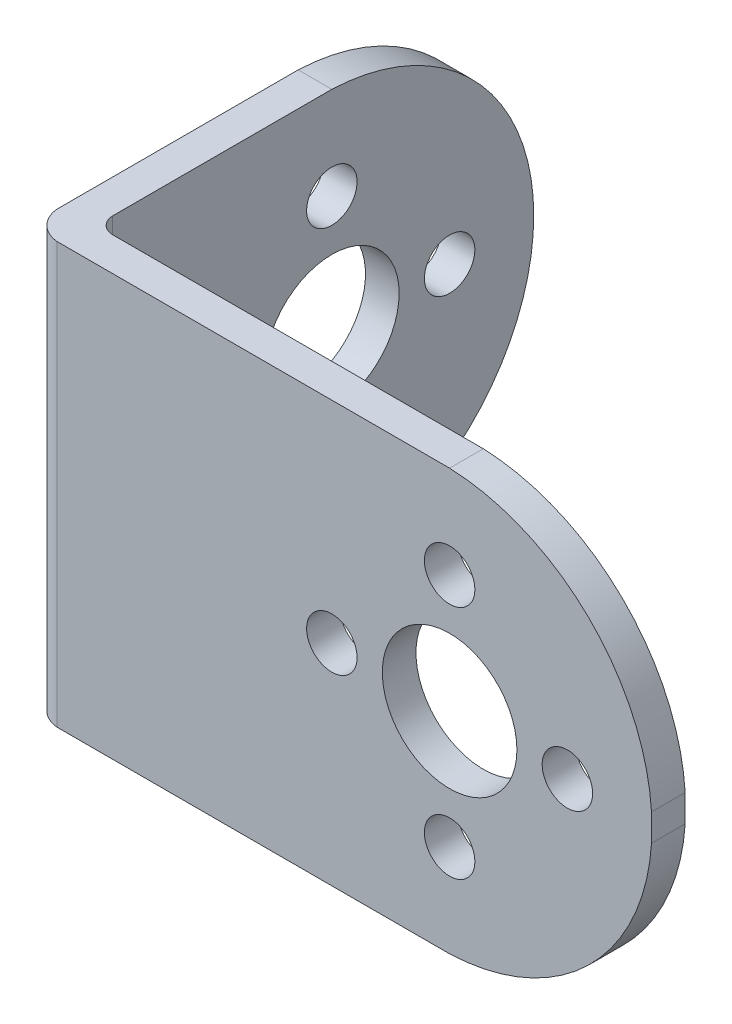
ISO-10303-21;
HEADER;
FILE_DESCRIPTION(('STEP AP214'),'2;1');
FILE_NAME('part.step','',(''),(''),'','','');
FILE_SCHEMA(('AUTOMOTIVE_DESIGN { 1 0 10303 214 1 1 1 1 }'));
ENDSEC;
DATA;
#1=APPLICATION_CONTEXT('core data for automotive mechanical design processes');
#2=APPLICATION_PROTOCOL_DEFINITION('international standard','automotive_design',2000,#1);
#3=PRODUCT_CONTEXT('',#1,'mechanical');
#4=PRODUCT('Part','Part','',(#3));
#5=PRODUCT_RELATED_PRODUCT_CATEGORY('part','',(#4));
#6=PRODUCT_DEFINITION_FORMATION('','',#4);
#7=PRODUCT_DEFINITION_CONTEXT('part definition',#1,'design');
#8=PRODUCT_DEFINITION('design','',#6,#7);
#9=PRODUCT_DEFINITION_SHAPE('','',#8);
#10=(LENGTH_UNIT() NAMED_UNIT(*) SI_UNIT(.MILLI.,.METRE.));
#11=(NAMED_UNIT(*) PLANE_ANGLE_UNIT() SI_UNIT($,.RADIAN.));
#12=(NAMED_UNIT(*) SI_UNIT($,.STERADIAN.) SOLID_ANGLE_UNIT());
#13=UNCERTAINTY_MEASURE_WITH_UNIT(LENGTH_MEASURE(1.E-05),#10,'distance_accuracy_value','');
#14=(GEOMETRIC_REPRESENTATION_CONTEXT(3) GLOBAL_UNCERTAINTY_ASSIGNED_CONTEXT((#13)) GLOBAL_UNIT_ASSIGNED_CONTEXT((#10,
#11,#12)) REPRESENTATION_CONTEXT('',''));
#15=CARTESIAN_POINT('',(0.,0.,0.));
#16=DIRECTION('',(0.,0.,1.));
#17=DIRECTION('',(1.,0.,0.));
#18=AXIS2_PLACEMENT_3D('',#15,#16,#17);
#19=CARTESIAN_POINT('',(0.,25.,0.));
#20=DIRECTION('',(0.,0.,-1.));
#21=DIRECTION('',(-1.,0.,0.));
#22=AXIS2_PLACEMENT_3D('',#19,#20,#21);
#23=PLANE('',#22);
#24=CARTESIAN_POINT('',(25.,19.5,0.));
#25=DIRECTION('',(0.,0.,1.));
#26=DIRECTION('',(1.,0.,0.));
#27=AXIS2_PLACEMENT_3D('',#24,#25,#26);
#28=CIRCLE('',#27,1.5);
#29=CARTESIAN_POINT('',(26.5,19.5,0.));
#30=VERTEX_POINT('',#29);
#31=EDGE_CURVE('E306',#30,#30,#28,.T.);
#32=ORIENTED_EDGE('',*,*,#31,.F.);
#33=EDGE_LOOP('',(#32));
#34=FACE_BOUND('',#33,.T.);
#35=CARTESIAN_POINT('',(32.0000000000001,12.5000000000001,0.));
#36=DIRECTION('',(0.,0.,1.));
#37=DIRECTION('',(1.,0.,0.));
#38=AXIS2_PLACEMENT_3D('',#35,#36,#37);
#39=CIRCLE('',#38,1.5);
#40=CARTESIAN_POINT('',(33.5000000000001,12.5000000000001,0.));
#41=VERTEX_POINT('',#40);
#42=EDGE_CURVE('E303',#41,#41,#39,.T.);
#43=ORIENTED_EDGE('',*,*,#42,.F.);
#44=EDGE_LOOP('',(#43));
#45=FACE_BOUND('',#44,.T.);
#46=CARTESIAN_POINT('',(25.0000000000002,5.5,0.));
#47=DIRECTION('',(0.,0.,1.));
#48=DIRECTION('',(1.,0.,0.));
#49=AXIS2_PLACEMENT_3D('',#46,#47,#48);
#50=CIRCLE('',#49,1.5);
#51=CARTESIAN_POINT('',(26.5000000000002,5.5,0.));
#52=VERTEX_POINT('',#51);
#53=EDGE_CURVE('E300',#52,#52,#50,.T.);
#54=ORIENTED_EDGE('',*,*,#53,.F.);
#55=EDGE_LOOP('',(#54));
#56=FACE_BOUND('',#55,.T.);
#57=CARTESIAN_POINT('',(18.0000000000001,12.5,0.));
#58=DIRECTION('',(0.,0.,1.));
#59=DIRECTION('',(1.,0.,0.));
#60=AXIS2_PLACEMENT_3D('',#57,#58,#59);
#61=CIRCLE('',#60,1.5);
#62=CARTESIAN_POINT('',(19.5000000000001,12.5,0.));
#63=VERTEX_POINT('',#62);
#64=EDGE_CURVE('E299',#63,#63,#61,.T.);
#65=ORIENTED_EDGE('',*,*,#64,.F.);
#66=EDGE_LOOP('',(#65));
#67=FACE_BOUND('',#66,.T.);
#68=CARTESIAN_POINT('',(25.,12.5,0.));
#69=DIRECTION('',(0.,0.,1.));
#70=DIRECTION('',(1.,0.,0.));
#71=AXIS2_PLACEMENT_3D('',#68,#69,#70);
#72=CIRCLE('',#71,4.);
#73=CARTESIAN_POINT('',(29.,12.5,0.));
#74=VERTEX_POINT('',#73);
#75=EDGE_CURVE('E157',#74,#74,#72,.T.);
#76=ORIENTED_EDGE('',*,*,#75,.F.);
#77=EDGE_LOOP('',(#76));
#78=FACE_BOUND('',#77,.T.);
#79=CARTESIAN_POINT('',(24.5166193979498,12.5,0.));
#80=DIRECTION('',(0.,0.,1.));
#81=DIRECTION('',(1.,0.,0.));
#82=AXIS2_PLACEMENT_3D('',#79,#80,#81);
#83=CIRCLE('',#82,12.5093427807554);
#84=CARTESIAN_POINT('',(37.,13.3055219120512,0.));
#85=VERTEX_POINT('',#84);
#86=CARTESIAN_POINT('',(25.,25.,0.));
#87=VERTEX_POINT('',#86);
#88=EDGE_CURVE('E113',#85,#87,#83,.T.);
#89=ORIENTED_EDGE('',*,*,#88,.T.);
#90=DIRECTION('',(1.,0.,0.));
#91=VECTOR('',#90,1.);
#92=CARTESIAN_POINT('',(0.,25.,0.));
#93=LINE('',#92,#91);
#94=CARTESIAN_POINT('',(1.65907540690337,25.,0.));
#95=VERTEX_POINT('',#94);
#96=EDGE_CURVE('E190',#95,#87,#93,.T.);
#97=ORIENTED_EDGE('',*,*,#96,.F.);
#98=DIRECTION('',(0.,-1.,0.));
#99=VECTOR('',#98,1.);
#100=CARTESIAN_POINT('',(1.65907540690337,25.,0.));
#101=LINE('',#100,#99);
#102=CARTESIAN_POINT('',(1.65907540690337,0.,0.));
#103=VERTEX_POINT('',#102);
#104=EDGE_CURVE('E134',#95,#103,#101,.T.);
#105=ORIENTED_EDGE('',*,*,#104,.T.);
#106=DIRECTION('',(1.,0.,0.));
#107=VECTOR('',#106,1.);
#108=CARTESIAN_POINT('',(0.,0.,0.));
#109=LINE('',#108,#107);
#110=CARTESIAN_POINT('',(25.,0.,0.));
#111=VERTEX_POINT('',#110);
#112=EDGE_CURVE('E203',#103,#111,#109,.T.);
#113=ORIENTED_EDGE('',*,*,#112,.T.);
#114=CARTESIAN_POINT('',(24.5166193979498,12.5,0.));
#115=DIRECTION('',(0.,0.,1.));
#116=DIRECTION('',(1.,0.,0.));
#117=AXIS2_PLACEMENT_3D('',#114,#115,#116);
#118=CIRCLE('',#117,12.5093427807554);
#119=CARTESIAN_POINT('',(37.,11.6944780879488,0.));
#120=VERTEX_POINT('',#119);
#121=EDGE_CURVE('E61',#111,#120,#118,.T.);
#122=ORIENTED_EDGE('',*,*,#121,.T.);
#123=DIRECTION('',(0.,-1.,0.));
#124=VECTOR('',#123,1.);
#125=CARTESIAN_POINT('',(37.,25.,0.));
#126=LINE('',#125,#124);
#127=EDGE_CURVE('E128',#85,#120,#126,.T.);
#128=ORIENTED_EDGE('',*,*,#127,.F.);
#129=EDGE_LOOP('',(#89,#97,#105,#113,#122,#128));
#130=FACE_BOUND('',#129,.T.);
#131=ADVANCED_FACE('F37',(#34,#45,#56,#67,#78,#130),#23,.F.);
#132=CARTESIAN_POINT('',(37.,25.,0.));
#133=DIRECTION('',(-1.,0.,0.));
#134=DIRECTION('',(0.,0.,1.));
#135=AXIS2_PLACEMENT_3D('',#132,#133,#134);
#136=PLANE('',#135);
#137=DIRECTION('',(0.,0.,1.));
#138=VECTOR('',#137,1.);
#139=CARTESIAN_POINT('',(37.,13.3055219120512,-25.));
#140=LINE('',#139,#138);
#141=CARTESIAN_POINT('',(37.,13.3055219120512,-2.));
#142=VERTEX_POINT('',#141);
#143=EDGE_CURVE('E116',#142,#85,#140,.T.);
#144=ORIENTED_EDGE('',*,*,#143,.T.);
#145=ORIENTED_EDGE('',*,*,#127,.T.);
#146=DIRECTION('',(0.,0.,1.));
#147=VECTOR('',#146,1.);
#148=CARTESIAN_POINT('',(37.,11.6944780879488,-25.));
#149=LINE('',#148,#147);
#150=CARTESIAN_POINT('',(37.,11.6944780879488,-2.));
#151=VERTEX_POINT('',#150);
#152=EDGE_CURVE('E121',#151,#120,#149,.T.);
#153=ORIENTED_EDGE('',*,*,#152,.F.);
#154=DIRECTION('',(0.,-1.,0.));
#155=VECTOR('',#154,1.);
#156=CARTESIAN_POINT('',(37.,25.,-2.));
#157=LINE('',#156,#155);
#158=EDGE_CURVE('E130',#142,#151,#157,.T.);
#159=ORIENTED_EDGE('',*,*,#158,.F.);
#160=EDGE_LOOP('',(#144,#145,#153,#159));
#161=FACE_BOUND('',#160,.T.);
#162=ADVANCED_FACE('F126',(#161),#136,.F.);
#163=CARTESIAN_POINT('',(0.,25.,-2.));
#164=DIRECTION('',(0.,0.,1.));
#165=DIRECTION('',(1.,0.,0.));
#166=AXIS2_PLACEMENT_3D('',#163,#164,#165);
#167=PLANE('',#166);
#168=CARTESIAN_POINT('',(25.,19.5,-2.));
#169=DIRECTION('',(0.,0.,1.));
#170=DIRECTION('',(1.,0.,0.));
#171=AXIS2_PLACEMENT_3D('',#168,#169,#170);
#172=CIRCLE('',#171,1.5);
#173=CARTESIAN_POINT('',(26.5,19.5,-2.));
#174=VERTEX_POINT('',#173);
#175=EDGE_CURVE('E41',#174,#174,#172,.T.);
#176=ORIENTED_EDGE('',*,*,#175,.T.);
#177=EDGE_LOOP('',(#176));
#178=FACE_BOUND('',#177,.T.);
#179=CARTESIAN_POINT('',(32.0000000000001,12.5000000000001,-2.));
#180=DIRECTION('',(0.,0.,1.));
#181=DIRECTION('',(1.,0.,0.));
#182=AXIS2_PLACEMENT_3D('',#179,#180,#181);
#183=CIRCLE('',#182,1.5);
#184=CARTESIAN_POINT('',(33.5000000000001,12.5000000000001,-2.));
#185=VERTEX_POINT('',#184);
#186=EDGE_CURVE('E162',#185,#185,#183,.T.);
#187=ORIENTED_EDGE('',*,*,#186,.T.);
#188=EDGE_LOOP('',(#187));
#189=FACE_BOUND('',#188,.T.);
#190=CARTESIAN_POINT('',(25.0000000000002,5.5,-2.));
#191=DIRECTION('',(0.,0.,1.));
#192=DIRECTION('',(1.,0.,0.));
#193=AXIS2_PLACEMENT_3D('',#190,#191,#192);
#194=CIRCLE('',#193,1.5);
#195=CARTESIAN_POINT('',(26.5000000000002,5.5,-2.));
#196=VERTEX_POINT('',#195);
#197=EDGE_CURVE('E160',#196,#196,#194,.T.);
#198=ORIENTED_EDGE('',*,*,#197,.T.);
#199=EDGE_LOOP('',(#198));
#200=FACE_BOUND('',#199,.T.);
#201=CARTESIAN_POINT('',(18.0000000000001,12.5,-2.));
#202=DIRECTION('',(0.,0.,1.));
#203=DIRECTION('',(1.,0.,0.));
#204=AXIS2_PLACEMENT_3D('',#201,#202,#203);
#205=CIRCLE('',#204,1.5);
#206=CARTESIAN_POINT('',(19.5000000000001,12.5,-2.));
#207=VERTEX_POINT('',#206);
#208=EDGE_CURVE('E156',#207,#207,#205,.T.);
#209=ORIENTED_EDGE('',*,*,#208,.T.);
#210=EDGE_LOOP('',(#209));
#211=FACE_BOUND('',#210,.T.);
#212=CARTESIAN_POINT('',(25.,12.5,-2.));
#213=DIRECTION('',(0.,0.,1.));
#214=DIRECTION('',(1.,0.,0.));
#215=AXIS2_PLACEMENT_3D('',#212,#213,#214);
#216=CIRCLE('',#215,4.);
#217=CARTESIAN_POINT('',(29.,12.5,-2.));
#218=VERTEX_POINT('',#217);
#219=EDGE_CURVE('E153',#218,#218,#216,.T.);
#220=ORIENTED_EDGE('',*,*,#219,.T.);
#221=EDGE_LOOP('',(#220));
#222=FACE_BOUND('',#221,.T.);
#223=CARTESIAN_POINT('',(24.5166193979498,12.5,-2.));
#224=DIRECTION('',(0.,0.,1.));
#225=DIRECTION('',(1.,0.,0.));
#226=AXIS2_PLACEMENT_3D('',#223,#224,#225);
#227=CIRCLE('',#226,12.5093427807554);
#228=CARTESIAN_POINT('',(25.,25.,-2.));
#229=VERTEX_POINT('',#228);
#230=EDGE_CURVE('E54',#142,#229,#227,.T.);
#231=ORIENTED_EDGE('',*,*,#230,.F.);
#232=ORIENTED_EDGE('',*,*,#158,.T.);
#233=CARTESIAN_POINT('',(24.5166193979498,12.5,-2.));
#234=DIRECTION('',(0.,0.,1.));
#235=DIRECTION('',(1.,0.,0.));
#236=AXIS2_PLACEMENT_3D('',#233,#234,#235);
#237=CIRCLE('',#236,12.5093427807554);
#238=CARTESIAN_POINT('',(25.,0.,-2.));
#239=VERTEX_POINT('',#238);
#240=EDGE_CURVE('E131',#239,#151,#237,.T.);
#241=ORIENTED_EDGE('',*,*,#240,.F.);
#242=DIRECTION('',(-1.,0.,0.));
#243=VECTOR('',#242,1.);
#244=CARTESIAN_POINT('',(0.,0.,-2.));
#245=LINE('',#244,#243);
#246=CARTESIAN_POINT('',(3.03872971417256,0.,-2.));
#247=VERTEX_POINT('',#246);
#248=EDGE_CURVE('E183',#239,#247,#245,.T.);
#249=ORIENTED_EDGE('',*,*,#248,.T.);
#250=DIRECTION('',(0.,-1.,0.));
#251=VECTOR('',#250,1.);
#252=CARTESIAN_POINT('',(3.03872971417256,25.,-2.));
#253=LINE('',#252,#251);
#254=CARTESIAN_POINT('',(3.03872971417256,25.,-2.));
#255=VERTEX_POINT('',#254);
#256=EDGE_CURVE('E139',#255,#247,#253,.T.);
#257=ORIENTED_EDGE('',*,*,#256,.F.);
#258=DIRECTION('',(-1.,0.,0.));
#259=VECTOR('',#258,1.);
#260=CARTESIAN_POINT('',(0.,25.,-2.));
#261=LINE('',#260,#259);
#262=EDGE_CURVE('E192',#229,#255,#261,.T.);
#263=ORIENTED_EDGE('',*,*,#262,.F.);
#264=EDGE_LOOP('',(#231,#232,#241,#249,#257,#263));
#265=FACE_BOUND('',#264,.T.);
#266=ADVANCED_FACE('F225',(#178,#189,#200,#211,#222,#265),#167,.F.);
#267=CARTESIAN_POINT('',(0.,25.,0.));
#268=DIRECTION('',(0.,1.,0.));
#269=DIRECTION('',(0.,0.,1.));
#270=AXIS2_PLACEMENT_3D('',#267,#268,#269);
#271=PLANE('',#270);
#272=ORIENTED_EDGE('',*,*,#96,.T.);
#273=DIRECTION('',(0.,0.,1.));
#274=VECTOR('',#273,1.);
#275=CARTESIAN_POINT('',(25.,25.,-25.));
#276=LINE('',#275,#274);
#277=EDGE_CURVE('E12',#87,#229,#276,.F.);
#278=ORIENTED_EDGE('',*,*,#277,.T.);
#279=ORIENTED_EDGE('',*,*,#262,.T.);
#280=CARTESIAN_POINT('',(3.00314791089518,25.,-3.00314791089518));
#281=DIRECTION('',(0.,1.,0.));
#282=DIRECTION('',(0.,0.,1.));
#283=AXIS2_PLACEMENT_3D('',#280,#281,#282);
#284=CIRCLE('',#283,1.00377875842132);
#285=CARTESIAN_POINT('',(2.,25.,-2.9675661076178));
#286=VERTEX_POINT('',#285);
#287=EDGE_CURVE('E179',#286,#255,#284,.T.);
#288=ORIENTED_EDGE('',*,*,#287,.F.);
#289=DIRECTION('',(0.,0.,1.));
#290=VECTOR('',#289,1.);
#291=CARTESIAN_POINT('',(2.,25.,0.));
#292=LINE('',#291,#290);
#293=CARTESIAN_POINT('',(2.,25.,-16.));
#294=VERTEX_POINT('',#293);
#295=EDGE_CURVE('E182',#294,#286,#292,.T.);
#296=ORIENTED_EDGE('',*,*,#295,.F.);
#297=DIRECTION('',(-1.,0.,0.));
#298=VECTOR('',#297,1.);
#299=CARTESIAN_POINT('',(25.,25.,-16.));
#300=LINE('',#299,#298);
#301=CARTESIAN_POINT('',(0.,25.,-16.));
#302=VERTEX_POINT('',#301);
#303=EDGE_CURVE('E147',#302,#294,#300,.F.);
#304=ORIENTED_EDGE('',*,*,#303,.F.);
#305=DIRECTION('',(0.,0.,-1.));
#306=VECTOR('',#305,1.);
#307=CARTESIAN_POINT('',(0.,25.,0.));
#308=LINE('',#307,#306);
#309=CARTESIAN_POINT('',(0.,25.,-1.65907540690337));
#310=VERTEX_POINT('',#309);
#311=EDGE_CURVE('E185',#310,#302,#308,.T.);
#312=ORIENTED_EDGE('',*,*,#311,.F.);
#313=CARTESIAN_POINT('',(1.82953770345169,25.,-1.82953770345169));
#314=DIRECTION('',(0.,1.,0.));
#315=DIRECTION('',(0.,0.,1.));
#316=AXIS2_PLACEMENT_3D('',#313,#314,#315);
#317=CIRCLE('',#316,1.83746172828056);
#318=EDGE_CURVE('E188',#310,#95,#317,.T.);
#319=ORIENTED_EDGE('',*,*,#318,.T.);
#320=EDGE_LOOP('',(#272,#278,#279,#288,#296,#304,#312,#319));
#321=FACE_BOUND('',#320,.T.);
#322=ADVANCED_FACE('F223',(#321),#271,.T.);
#323=CARTESIAN_POINT('',(0.,0.,0.));
#324=DIRECTION('',(0.,1.,0.));
#325=DIRECTION('',(0.,0.,1.));
#326=AXIS2_PLACEMENT_3D('',#323,#324,#325);
#327=PLANE('',#326);
#328=DIRECTION('',(0.,0.,1.));
#329=VECTOR('',#328,1.);
#330=CARTESIAN_POINT('',(25.,0.,-25.));
#331=LINE('',#330,#329);
#332=EDGE_CURVE('E46',#111,#239,#331,.F.);
#333=ORIENTED_EDGE('',*,*,#332,.F.);
#334=ORIENTED_EDGE('',*,*,#112,.F.);
#335=CARTESIAN_POINT('',(1.82953770345169,0.,-1.82953770345169));
#336=DIRECTION('',(0.,1.,0.));
#337=DIRECTION('',(0.,0.,1.));
#338=AXIS2_PLACEMENT_3D('',#335,#336,#337);
#339=CIRCLE('',#338,1.83746172828056);
#340=CARTESIAN_POINT('',(0.,0.,-1.65907540690337));
#341=VERTEX_POINT('',#340);
#342=EDGE_CURVE('E201',#341,#103,#339,.T.);
#343=ORIENTED_EDGE('',*,*,#342,.F.);
#344=DIRECTION('',(0.,0.,-1.));
#345=VECTOR('',#344,1.);
#346=CARTESIAN_POINT('',(0.,0.,0.));
#347=LINE('',#346,#345);
#348=CARTESIAN_POINT('',(0.,0.,-16.));
#349=VERTEX_POINT('',#348);
#350=EDGE_CURVE('E198',#341,#349,#347,.T.);
#351=ORIENTED_EDGE('',*,*,#350,.T.);
#352=DIRECTION('',(-1.,0.,0.));
#353=VECTOR('',#352,1.);
#354=CARTESIAN_POINT('',(25.,0.,-16.));
#355=LINE('',#354,#353);
#356=CARTESIAN_POINT('',(2.,0.,-16.));
#357=VERTEX_POINT('',#356);
#358=EDGE_CURVE('E149',#349,#357,#355,.F.);
#359=ORIENTED_EDGE('',*,*,#358,.T.);
#360=DIRECTION('',(0.,0.,1.));
#361=VECTOR('',#360,1.);
#362=CARTESIAN_POINT('',(2.,0.,0.));
#363=LINE('',#362,#361);
#364=CARTESIAN_POINT('',(2.,0.,-2.9675661076178));
#365=VERTEX_POINT('',#364);
#366=EDGE_CURVE('E196',#357,#365,#363,.T.);
#367=ORIENTED_EDGE('',*,*,#366,.T.);
#368=CARTESIAN_POINT('',(3.00314791089518,0.,-3.00314791089518));
#369=DIRECTION('',(0.,1.,0.));
#370=DIRECTION('',(0.,0.,1.));
#371=AXIS2_PLACEMENT_3D('',#368,#369,#370);
#372=CIRCLE('',#371,1.00377875842132);
#373=EDGE_CURVE('E178',#365,#247,#372,.T.);
#374=ORIENTED_EDGE('',*,*,#373,.T.);
#375=ORIENTED_EDGE('',*,*,#248,.F.);
#376=EDGE_LOOP('',(#333,#334,#343,#351,#359,#367,#374,#375));
#377=FACE_BOUND('',#376,.T.);
#378=ADVANCED_FACE('F215',(#377),#327,.F.);
#379=CARTESIAN_POINT('',(2.,25.,0.));
#380=DIRECTION('',(1.,0.,0.));
#381=DIRECTION('',(0.,0.,-1.));
#382=AXIS2_PLACEMENT_3D('',#379,#380,#381);
#383=PLANE('',#382);
#384=CARTESIAN_POINT('',(2.,5.5,-16.));
#385=DIRECTION('',(1.,0.,0.));
#386=DIRECTION('',(0.,0.,-1.));
#387=AXIS2_PLACEMENT_3D('',#384,#385,#386);
#388=CIRCLE('',#387,1.5);
#389=CARTESIAN_POINT('',(2.,5.5,-17.5));
#390=VERTEX_POINT('',#389);
#391=EDGE_CURVE('E271',#390,#390,#388,.T.);
#392=ORIENTED_EDGE('',*,*,#391,.F.);
#393=EDGE_LOOP('',(#392));
#394=FACE_BOUND('',#393,.T.);
#395=CARTESIAN_POINT('',(2.,12.5,-23.));
#396=DIRECTION('',(1.,0.,0.));
#397=DIRECTION('',(0.,0.,-1.));
#398=AXIS2_PLACEMENT_3D('',#395,#396,#397);
#399=CIRCLE('',#398,1.5);
#400=CARTESIAN_POINT('',(2.,12.5,-24.5));
#401=VERTEX_POINT('',#400);
#402=EDGE_CURVE('E275',#401,#401,#399,.T.);
#403=ORIENTED_EDGE('',*,*,#402,.F.);
#404=EDGE_LOOP('',(#403));
#405=FACE_BOUND('',#404,.T.);
#406=CARTESIAN_POINT('',(2.,19.5,-15.9999999999999));
#407=DIRECTION('',(1.,0.,0.));
#408=DIRECTION('',(0.,0.,-1.));
#409=AXIS2_PLACEMENT_3D('',#406,#407,#408);
#410=CIRCLE('',#409,1.5);
#411=CARTESIAN_POINT('',(2.,19.5,-17.4999999999999));
#412=VERTEX_POINT('',#411);
#413=EDGE_CURVE('E279',#412,#412,#410,.T.);
#414=ORIENTED_EDGE('',*,*,#413,.F.);
#415=EDGE_LOOP('',(#414));
#416=FACE_BOUND('',#415,.T.);
#417=CARTESIAN_POINT('',(2.,12.4999999999999,-9.));
#418=DIRECTION('',(1.,0.,0.));
#419=DIRECTION('',(0.,0.,-1.));
#420=AXIS2_PLACEMENT_3D('',#417,#418,#419);
#421=CIRCLE('',#420,1.5);
#422=CARTESIAN_POINT('',(2.,12.4999999999999,-10.5));
#423=VERTEX_POINT('',#422);
#424=EDGE_CURVE('E283',#423,#423,#421,.T.);
#425=ORIENTED_EDGE('',*,*,#424,.F.);
#426=EDGE_LOOP('',(#425));
#427=FACE_BOUND('',#426,.T.);
#428=CARTESIAN_POINT('',(2.,12.5,-16.));
#429=DIRECTION('',(1.,0.,0.));
#430=DIRECTION('',(0.,0.,-1.));
#431=AXIS2_PLACEMENT_3D('',#428,#429,#430);
#432=CIRCLE('',#431,4.);
#433=CARTESIAN_POINT('',(2.,12.5,-20.));
#434=VERTEX_POINT('',#433);
#435=EDGE_CURVE('E286',#434,#434,#432,.T.);
#436=ORIENTED_EDGE('',*,*,#435,.F.);
#437=EDGE_LOOP('',(#436));
#438=FACE_BOUND('',#437,.T.);
#439=ORIENTED_EDGE('',*,*,#366,.F.);
#440=CARTESIAN_POINT('',(2.,12.5,-15.4895833333333));
#441=DIRECTION('',(1.,0.,0.));
#442=DIRECTION('',(0.,0.,-1.));
#443=AXIS2_PLACEMENT_3D('',#440,#441,#442);
#444=CIRCLE('',#443,12.5104166666667);
#445=EDGE_CURVE('E176',#294,#357,#444,.F.);
#446=ORIENTED_EDGE('',*,*,#445,.F.);
#447=ORIENTED_EDGE('',*,*,#295,.T.);
#448=DIRECTION('',(0.,-1.,0.));
#449=VECTOR('',#448,1.);
#450=CARTESIAN_POINT('',(2.,25.,-2.9675661076178));
#451=LINE('',#450,#449);
#452=EDGE_CURVE('E144',#286,#365,#451,.T.);
#453=ORIENTED_EDGE('',*,*,#452,.T.);
#454=EDGE_LOOP('',(#439,#446,#447,#453));
#455=FACE_BOUND('',#454,.T.);
#456=ADVANCED_FACE('F220',(#394,#405,#416,#427,#438,#455),#383,.T.);
#457=CARTESIAN_POINT('',(0.,25.,0.));
#458=DIRECTION('',(-1.,0.,0.));
#459=DIRECTION('',(0.,0.,1.));
#460=AXIS2_PLACEMENT_3D('',#457,#458,#459);
#461=PLANE('',#460);
#462=CARTESIAN_POINT('',(0.,5.5,-16.));
#463=DIRECTION('',(-1.,0.,0.));
#464=DIRECTION('',(0.,0.,1.));
#465=AXIS2_PLACEMENT_3D('',#462,#463,#464);
#466=CIRCLE('',#465,1.5);
#467=CARTESIAN_POINT('',(0.,5.5,-14.5));
#468=VERTEX_POINT('',#467);
#469=EDGE_CURVE('E292',#468,#468,#466,.T.);
#470=ORIENTED_EDGE('',*,*,#469,.F.);
#471=EDGE_LOOP('',(#470));
#472=FACE_BOUND('',#471,.T.);
#473=CARTESIAN_POINT('',(0.,12.5,-23.));
#474=DIRECTION('',(-1.,0.,0.));
#475=DIRECTION('',(0.,0.,1.));
#476=AXIS2_PLACEMENT_3D('',#473,#474,#475);
#477=CIRCLE('',#476,1.5);
#478=CARTESIAN_POINT('',(0.,12.5,-21.5));
#479=VERTEX_POINT('',#478);
#480=EDGE_CURVE('E451',#479,#479,#477,.T.);
#481=ORIENTED_EDGE('',*,*,#480,.F.);
#482=EDGE_LOOP('',(#481));
#483=FACE_BOUND('',#482,.T.);
#484=CARTESIAN_POINT('',(0.,19.5,-15.9999999999999));
#485=DIRECTION('',(-1.,0.,0.));
#486=DIRECTION('',(0.,0.,1.));
#487=AXIS2_PLACEMENT_3D('',#484,#485,#486);
#488=CIRCLE('',#487,1.5);
#489=CARTESIAN_POINT('',(0.,19.5,-14.4999999999999));
#490=VERTEX_POINT('',#489);
#491=EDGE_CURVE('E454',#490,#490,#488,.T.);
#492=ORIENTED_EDGE('',*,*,#491,.F.);
#493=EDGE_LOOP('',(#492));
#494=FACE_BOUND('',#493,.T.);
#495=CARTESIAN_POINT('',(0.,12.4999999999999,-9.));
#496=DIRECTION('',(-1.,0.,0.));
#497=DIRECTION('',(0.,0.,1.));
#498=AXIS2_PLACEMENT_3D('',#495,#496,#497);
#499=CIRCLE('',#498,1.5);
#500=CARTESIAN_POINT('',(0.,12.4999999999999,-7.5));
#501=VERTEX_POINT('',#500);
#502=EDGE_CURVE('E456',#501,#501,#499,.T.);
#503=ORIENTED_EDGE('',*,*,#502,.F.);
#504=EDGE_LOOP('',(#503));
#505=FACE_BOUND('',#504,.T.);
#506=CARTESIAN_POINT('',(0.,12.5,-16.));
#507=DIRECTION('',(-1.,0.,0.));
#508=DIRECTION('',(0.,0.,1.));
#509=AXIS2_PLACEMENT_3D('',#506,#507,#508);
#510=CIRCLE('',#509,4.);
#511=CARTESIAN_POINT('',(0.,12.5,-12.));
#512=VERTEX_POINT('',#511);
#513=EDGE_CURVE('E288',#512,#512,#510,.T.);
#514=ORIENTED_EDGE('',*,*,#513,.F.);
#515=EDGE_LOOP('',(#514));
#516=FACE_BOUND('',#515,.T.);
#517=CARTESIAN_POINT('',(0.,12.5,-15.4895833333333));
#518=DIRECTION('',(-1.,0.,0.));
#519=DIRECTION('',(0.,0.,1.));
#520=AXIS2_PLACEMENT_3D('',#517,#518,#519);
#521=CIRCLE('',#520,12.5104166666667);
#522=EDGE_CURVE('E174',#349,#302,#521,.F.);
#523=ORIENTED_EDGE('',*,*,#522,.F.);
#524=ORIENTED_EDGE('',*,*,#350,.F.);
#525=DIRECTION('',(0.,-1.,0.));
#526=VECTOR('',#525,1.);
#527=CARTESIAN_POINT('',(0.,25.,-1.65907540690337));
#528=LINE('',#527,#526);
#529=EDGE_CURVE('E137',#310,#341,#528,.T.);
#530=ORIENTED_EDGE('',*,*,#529,.F.);
#531=ORIENTED_EDGE('',*,*,#311,.T.);
#532=EDGE_LOOP('',(#523,#524,#530,#531));
#533=FACE_BOUND('',#532,.T.);
#534=ADVANCED_FACE('F237',(#472,#483,#494,#505,#516,#533),#461,.T.);
#535=CARTESIAN_POINT('',(3.00314791089518,25.,-3.00314791089518));
#536=DIRECTION('',(0.,-1.,0.));
#537=DIRECTION('',(0.,0.,-1.));
#538=AXIS2_PLACEMENT_3D('',#535,#536,#537);
#539=CYLINDRICAL_SURFACE('',#538,1.00377875842132);
#540=ORIENTED_EDGE('',*,*,#373,.F.);
#541=ORIENTED_EDGE('',*,*,#452,.F.);
#542=ORIENTED_EDGE('',*,*,#287,.T.);
#543=ORIENTED_EDGE('',*,*,#256,.T.);
#544=EDGE_LOOP('',(#540,#541,#542,#543));
#545=FACE_BOUND('',#544,.T.);
#546=ADVANCED_FACE('F39',(#545),#539,.F.);
#547=CARTESIAN_POINT('',(1.82953770345169,25.,-1.82953770345169));
#548=DIRECTION('',(0.,-1.,0.));
#549=DIRECTION('',(0.,0.,-1.));
#550=AXIS2_PLACEMENT_3D('',#547,#548,#549);
#551=CYLINDRICAL_SURFACE('',#550,1.83746172828056);
#552=ORIENTED_EDGE('',*,*,#342,.T.);
#553=ORIENTED_EDGE('',*,*,#104,.F.);
#554=ORIENTED_EDGE('',*,*,#318,.F.);
#555=ORIENTED_EDGE('',*,*,#529,.T.);
#556=EDGE_LOOP('',(#552,#553,#554,#555));
#557=FACE_BOUND('',#556,.T.);
#558=ADVANCED_FACE('F233',(#557),#551,.T.);
#559=CARTESIAN_POINT('',(25.,12.5,-15.4895833333333));
#560=DIRECTION('',(-1.,0.,0.));
#561=DIRECTION('',(0.,0.,1.));
#562=AXIS2_PLACEMENT_3D('',#559,#560,#561);
#563=CYLINDRICAL_SURFACE('',#562,12.5104166666667);
#564=ORIENTED_EDGE('',*,*,#445,.T.);
#565=ORIENTED_EDGE('',*,*,#358,.F.);
#566=ORIENTED_EDGE('',*,*,#522,.T.);
#567=ORIENTED_EDGE('',*,*,#303,.T.);
#568=EDGE_LOOP('',(#564,#565,#566,#567));
#569=FACE_BOUND('',#568,.T.);
#570=ADVANCED_FACE('F239',(#569),#563,.T.);
#571=CARTESIAN_POINT('',(24.5166193979498,12.5,-25.));
#572=DIRECTION('',(0.,0.,1.));
#573=DIRECTION('',(1.,0.,0.));
#574=AXIS2_PLACEMENT_3D('',#571,#572,#573);
#575=CYLINDRICAL_SURFACE('',#574,12.5093427807554);
#576=ORIENTED_EDGE('',*,*,#240,.T.);
#577=ORIENTED_EDGE('',*,*,#152,.T.);
#578=ORIENTED_EDGE('',*,*,#121,.F.);
#579=ORIENTED_EDGE('',*,*,#332,.T.);
#580=EDGE_LOOP('',(#576,#577,#578,#579));
#581=FACE_BOUND('',#580,.T.);
#582=ADVANCED_FACE('F227',(#581),#575,.T.);
#583=CARTESIAN_POINT('',(24.5166193979498,12.5,-25.));
#584=DIRECTION('',(0.,0.,1.));
#585=DIRECTION('',(1.,0.,0.));
#586=AXIS2_PLACEMENT_3D('',#583,#584,#585);
#587=CYLINDRICAL_SURFACE('',#586,12.5093427807554);
#588=ORIENTED_EDGE('',*,*,#230,.T.);
#589=ORIENTED_EDGE('',*,*,#277,.F.);
#590=ORIENTED_EDGE('',*,*,#88,.F.);
#591=ORIENTED_EDGE('',*,*,#143,.F.);
#592=EDGE_LOOP('',(#588,#589,#590,#591));
#593=FACE_BOUND('',#592,.T.);
#594=ADVANCED_FACE('F115',(#593),#587,.T.);
#595=CARTESIAN_POINT('',(25.,12.5,-25.));
#596=DIRECTION('',(0.,0.,1.));
#597=DIRECTION('',(1.,0.,0.));
#598=AXIS2_PLACEMENT_3D('',#595,#596,#597);
#599=CYLINDRICAL_SURFACE('',#598,4.);
#600=ORIENTED_EDGE('',*,*,#75,.T.);
#601=EDGE_LOOP('',(#600));
#602=FACE_BOUND('',#601,.T.);
#603=ORIENTED_EDGE('',*,*,#219,.F.);
#604=EDGE_LOOP('',(#603));
#605=FACE_BOUND('',#604,.T.);
#606=ADVANCED_FACE('F314',(#602,#605),#599,.F.);
#607=CARTESIAN_POINT('',(18.0000000000001,12.5,-25.));
#608=DIRECTION('',(0.,0.,1.));
#609=DIRECTION('',(1.,0.,0.));
#610=AXIS2_PLACEMENT_3D('',#607,#608,#609);
#611=CYLINDRICAL_SURFACE('',#610,1.5);
#612=ORIENTED_EDGE('',*,*,#64,.T.);
#613=EDGE_LOOP('',(#612));
#614=FACE_BOUND('',#613,.T.);
#615=ORIENTED_EDGE('',*,*,#208,.F.);
#616=EDGE_LOOP('',(#615));
#617=FACE_BOUND('',#616,.T.);
#618=ADVANCED_FACE('F318',(#614,#617),#611,.F.);
#619=CARTESIAN_POINT('',(25.0000000000002,5.5,-25.));
#620=DIRECTION('',(0.,0.,1.));
#621=DIRECTION('',(1.,0.,0.));
#622=AXIS2_PLACEMENT_3D('',#619,#620,#621);
#623=CYLINDRICAL_SURFACE('',#622,1.5);
#624=ORIENTED_EDGE('',*,*,#53,.T.);
#625=EDGE_LOOP('',(#624));
#626=FACE_BOUND('',#625,.T.);
#627=ORIENTED_EDGE('',*,*,#197,.F.);
#628=EDGE_LOOP('',(#627));
#629=FACE_BOUND('',#628,.T.);
#630=ADVANCED_FACE('F332',(#626,#629),#623,.F.);
#631=CARTESIAN_POINT('',(32.0000000000001,12.5000000000001,-25.));
#632=DIRECTION('',(0.,0.,1.));
#633=DIRECTION('',(1.,0.,0.));
#634=AXIS2_PLACEMENT_3D('',#631,#632,#633);
#635=CYLINDRICAL_SURFACE('',#634,1.5);
#636=ORIENTED_EDGE('',*,*,#42,.T.);
#637=EDGE_LOOP('',(#636));
#638=FACE_BOUND('',#637,.T.);
#639=ORIENTED_EDGE('',*,*,#186,.F.);
#640=EDGE_LOOP('',(#639));
#641=FACE_BOUND('',#640,.T.);
#642=ADVANCED_FACE('F338',(#638,#641),#635,.F.);
#643=CARTESIAN_POINT('',(25.,19.5,-25.));
#644=DIRECTION('',(0.,0.,1.));
#645=DIRECTION('',(1.,0.,0.));
#646=AXIS2_PLACEMENT_3D('',#643,#644,#645);
#647=CYLINDRICAL_SURFACE('',#646,1.5);
#648=ORIENTED_EDGE('',*,*,#31,.T.);
#649=EDGE_LOOP('',(#648));
#650=FACE_BOUND('',#649,.T.);
#651=ORIENTED_EDGE('',*,*,#175,.F.);
#652=EDGE_LOOP('',(#651));
#653=FACE_BOUND('',#652,.T.);
#654=ADVANCED_FACE('F343',(#650,#653),#647,.F.);
#655=CARTESIAN_POINT('',(25.,12.5,-16.));
#656=DIRECTION('',(-1.,0.,0.));
#657=DIRECTION('',(0.,0.,1.));
#658=AXIS2_PLACEMENT_3D('',#655,#656,#657);
#659=CYLINDRICAL_SURFACE('',#658,4.);
#660=ORIENTED_EDGE('',*,*,#435,.T.);
#661=EDGE_LOOP('',(#660));
#662=FACE_BOUND('',#661,.T.);
#663=ORIENTED_EDGE('',*,*,#513,.T.);
#664=EDGE_LOOP('',(#663));
#665=FACE_BOUND('',#664,.T.);
#666=ADVANCED_FACE('F346',(#662,#665),#659,.F.);
#667=CARTESIAN_POINT('',(25.,12.4999999999999,-9.));
#668=DIRECTION('',(-1.,0.,0.));
#669=DIRECTION('',(0.,0.,1.));
#670=AXIS2_PLACEMENT_3D('',#667,#668,#669);
#671=CYLINDRICAL_SURFACE('',#670,1.5);
#672=ORIENTED_EDGE('',*,*,#424,.T.);
#673=EDGE_LOOP('',(#672));
#674=FACE_BOUND('',#673,.T.);
#675=ORIENTED_EDGE('',*,*,#502,.T.);
#676=EDGE_LOOP('',(#675));
#677=FACE_BOUND('',#676,.T.);
#678=ADVANCED_FACE('F406',(#674,#677),#671,.F.);
#679=CARTESIAN_POINT('',(25.,19.5,-15.9999999999999));
#680=DIRECTION('',(-1.,0.,0.));
#681=DIRECTION('',(0.,0.,1.));
#682=AXIS2_PLACEMENT_3D('',#679,#680,#681);
#683=CYLINDRICAL_SURFACE('',#682,1.5);
#684=ORIENTED_EDGE('',*,*,#413,.T.);
#685=EDGE_LOOP('',(#684));
#686=FACE_BOUND('',#685,.T.);
#687=ORIENTED_EDGE('',*,*,#491,.T.);
#688=EDGE_LOOP('',(#687));
#689=FACE_BOUND('',#688,.T.);
#690=ADVANCED_FACE('F414',(#686,#689),#683,.F.);
#691=CARTESIAN_POINT('',(25.,12.5,-23.));
#692=DIRECTION('',(-1.,0.,0.));
#693=DIRECTION('',(0.,0.,1.));
#694=AXIS2_PLACEMENT_3D('',#691,#692,#693);
#695=CYLINDRICAL_SURFACE('',#694,1.5);
#696=ORIENTED_EDGE('',*,*,#402,.T.);
#697=EDGE_LOOP('',(#696));
#698=FACE_BOUND('',#697,.T.);
#699=ORIENTED_EDGE('',*,*,#480,.T.);
#700=EDGE_LOOP('',(#699));
#701=FACE_BOUND('',#700,.T.);
#702=ADVANCED_FACE('F424',(#698,#701),#695,.F.);
#703=CARTESIAN_POINT('',(25.,5.5,-16.));
#704=DIRECTION('',(-1.,0.,0.));
#705=DIRECTION('',(0.,0.,1.));
#706=AXIS2_PLACEMENT_3D('',#703,#704,#705);
#707=CYLINDRICAL_SURFACE('',#706,1.5);
#708=ORIENTED_EDGE('',*,*,#391,.T.);
#709=EDGE_LOOP('',(#708));
#710=FACE_BOUND('',#709,.T.);
#711=ORIENTED_EDGE('',*,*,#469,.T.);
#712=EDGE_LOOP('',(#711));
#713=FACE_BOUND('',#712,.T.);
#714=ADVANCED_FACE('F434',(#710,#713),#707,.F.);
#715=CLOSED_SHELL('',(#131,#162,#266,#322,#378,#456,#534,#546,#558,#570,#582,#594,#606,#618,
#630,#642,#654,#666,#678,#690,#702,#714));
#716=MANIFOLD_SOLID_BREP('B2',#715);
#717=ADVANCED_BREP_SHAPE_REPRESENTATION('',(#18,#716),#14);
#718=SHAPE_DEFINITION_REPRESENTATION(#9,#717);
ENDSEC;
END-ISO-10303-21;
